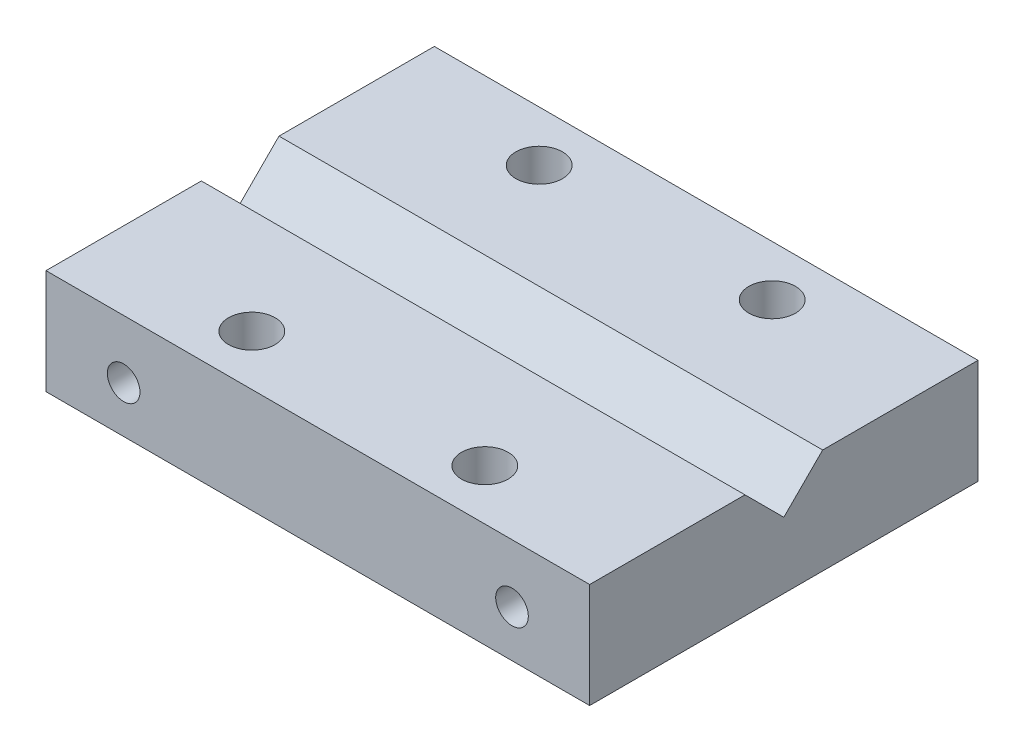
ISO-10303-21;
HEADER;
FILE_DESCRIPTION(('STEP AP214'),'2;1');
FILE_NAME('part.step','',(''),(''),'','','');
FILE_SCHEMA(('AUTOMOTIVE_DESIGN { 1 0 10303 214 1 1 1 1 }'));
ENDSEC;
DATA;
#1=APPLICATION_CONTEXT('core data for automotive mechanical design processes');
#2=APPLICATION_PROTOCOL_DEFINITION('international standard','automotive_design',2000,#1);
#3=PRODUCT_CONTEXT('',#1,'mechanical');
#4=PRODUCT('Part','Part','',(#3));
#5=PRODUCT_RELATED_PRODUCT_CATEGORY('part','',(#4));
#6=PRODUCT_DEFINITION_FORMATION('','',#4);
#7=PRODUCT_DEFINITION_CONTEXT('part definition',#1,'design');
#8=PRODUCT_DEFINITION('design','',#6,#7);
#9=PRODUCT_DEFINITION_SHAPE('','',#8);
#10=(LENGTH_UNIT() NAMED_UNIT(*) SI_UNIT(.MILLI.,.METRE.));
#11=(NAMED_UNIT(*) PLANE_ANGLE_UNIT() SI_UNIT($,.RADIAN.));
#12=(NAMED_UNIT(*) SI_UNIT($,.STERADIAN.) SOLID_ANGLE_UNIT());
#13=UNCERTAINTY_MEASURE_WITH_UNIT(LENGTH_MEASURE(1.E-05),#10,'distance_accuracy_value','');
#14=(GEOMETRIC_REPRESENTATION_CONTEXT(3) GLOBAL_UNCERTAINTY_ASSIGNED_CONTEXT((#13)) GLOBAL_UNIT_ASSIGNED_CONTEXT((#10,
#11,#12)) REPRESENTATION_CONTEXT('',''));
#15=CARTESIAN_POINT('',(0.,0.,0.));
#16=DIRECTION('',(0.,0.,1.));
#17=DIRECTION('',(1.,0.,0.));
#18=AXIS2_PLACEMENT_3D('',#15,#16,#17);
#19=CARTESIAN_POINT('',(0.,13.5,0.));
#20=DIRECTION('',(0.,1.,0.));
#21=DIRECTION('',(0.,0.,1.));
#22=AXIS2_PLACEMENT_3D('',#19,#20,#21);
#23=PLANE('',#22);
#24=CARTESIAN_POINT('',(17.7980364656382,13.5,15.5406732117812));
#25=DIRECTION('',(0.,1.,0.));
#26=DIRECTION('',(0.,0.,1.));
#27=AXIS2_PLACEMENT_3D('',#24,#25,#26);
#28=CIRCLE('',#27,3.);
#29=CARTESIAN_POINT('',(17.7980364656382,13.5,18.5406732117812));
#30=VERTEX_POINT('',#29);
#31=EDGE_CURVE('E199',#30,#30,#28,.F.);
#32=ORIENTED_EDGE('',*,*,#31,.T.);
#33=EDGE_LOOP('',(#32));
#34=FACE_BOUND('',#33,.T.);
#35=CARTESIAN_POINT('',(-12.2019635343618,13.5,15.5406732117812));
#36=DIRECTION('',(0.,1.,0.));
#37=DIRECTION('',(0.,0.,1.));
#38=AXIS2_PLACEMENT_3D('',#35,#36,#37);
#39=CIRCLE('',#38,3.);
#40=CARTESIAN_POINT('',(-12.2019635343618,13.5,18.5406732117812));
#41=VERTEX_POINT('',#40);
#42=EDGE_CURVE('E190',#41,#41,#39,.F.);
#43=ORIENTED_EDGE('',*,*,#42,.T.);
#44=EDGE_LOOP('',(#43));
#45=FACE_BOUND('',#44,.T.);
#46=DIRECTION('',(1.,0.,0.));
#47=VECTOR('',#46,1.);
#48=CARTESIAN_POINT('',(0.,13.5,2.04067321178118));
#49=LINE('',#48,#47);
#50=CARTESIAN_POINT('',(-32.2019635343618,13.5,2.04067321178118));
#51=VERTEX_POINT('',#50);
#52=CARTESIAN_POINT('',(37.7980364656382,13.5,2.04067321178118));
#53=VERTEX_POINT('',#52);
#54=EDGE_CURVE('E11',#51,#53,#49,.T.);
#55=ORIENTED_EDGE('',*,*,#54,.F.);
#56=DIRECTION('',(0.,0.,1.));
#57=VECTOR('',#56,1.);
#58=CARTESIAN_POINT('',(-32.2019635343618,13.5,-27.9593267882188));
#59=LINE('',#58,#57);
#60=CARTESIAN_POINT('',(-32.2019635343618,13.5,22.0406732117812));
#61=VERTEX_POINT('',#60);
#62=EDGE_CURVE('E100',#51,#61,#59,.T.);
#63=ORIENTED_EDGE('',*,*,#62,.T.);
#64=DIRECTION('',(1.,0.,0.));
#65=VECTOR('',#64,1.);
#66=CARTESIAN_POINT('',(-32.2019635343618,13.5,22.0406732117812));
#67=LINE('',#66,#65);
#68=CARTESIAN_POINT('',(37.7980364656382,13.5,22.0406732117812));
#69=VERTEX_POINT('',#68);
#70=EDGE_CURVE('E216',#61,#69,#67,.T.);
#71=ORIENTED_EDGE('',*,*,#70,.T.);
#72=DIRECTION('',(0.,0.,-1.));
#73=VECTOR('',#72,1.);
#74=CARTESIAN_POINT('',(37.7980364656382,13.5,-27.9593267882188));
#75=LINE('',#74,#73);
#76=EDGE_CURVE('E219',#69,#53,#75,.T.);
#77=ORIENTED_EDGE('',*,*,#76,.T.);
#78=EDGE_LOOP('',(#55,#63,#71,#77));
#79=FACE_BOUND('',#78,.T.);
#80=ADVANCED_FACE('F47',(#34,#45,#79),#23,.T.);
#81=CARTESIAN_POINT('',(-32.2019635343618,13.5,-27.9593267882188));
#82=DIRECTION('',(1.,0.,0.));
#83=DIRECTION('',(0.,0.,-1.));
#84=AXIS2_PLACEMENT_3D('',#81,#82,#83);
#85=PLANE('',#84);
#86=ORIENTED_EDGE('',*,*,#62,.F.);
#87=DIRECTION('',(0.,0.70710678118655,0.707106781186545));
#88=VECTOR('',#87,1.);
#89=CARTESIAN_POINT('',(-32.2019635343618,8.5,-2.95932678821879));
#90=LINE('',#89,#88);
#91=CARTESIAN_POINT('',(-32.2019635343618,8.5,-2.95932678821879));
#92=VERTEX_POINT('',#91);
#93=EDGE_CURVE('E202',#92,#51,#90,.T.);
#94=ORIENTED_EDGE('',*,*,#93,.F.);
#95=DIRECTION('',(0.,-0.707106781186544,0.707106781186551));
#96=VECTOR('',#95,1.);
#97=CARTESIAN_POINT('',(-32.2019635343618,8.5,-2.95932678821879));
#98=LINE('',#97,#96);
#99=CARTESIAN_POINT('',(-32.2019635343618,13.5,-7.95932678821884));
#100=VERTEX_POINT('',#99);
#101=EDGE_CURVE('E204',#100,#92,#98,.T.);
#102=ORIENTED_EDGE('',*,*,#101,.F.);
#103=CARTESIAN_POINT('',(-32.2019635343618,13.5,-27.9593267882188));
#104=VERTEX_POINT('',#103);
#105=EDGE_CURVE('E214',#104,#100,#59,.T.);
#106=ORIENTED_EDGE('',*,*,#105,.F.);
#107=DIRECTION('',(0.,-1.,0.));
#108=VECTOR('',#107,1.);
#109=CARTESIAN_POINT('',(-32.2019635343618,13.5,-27.9593267882188));
#110=LINE('',#109,#108);
#111=CARTESIAN_POINT('',(-32.2019635343618,0.,-27.9593267882188));
#112=VERTEX_POINT('',#111);
#113=EDGE_CURVE('E223',#104,#112,#110,.T.);
#114=ORIENTED_EDGE('',*,*,#113,.T.);
#115=DIRECTION('',(0.,0.,1.));
#116=VECTOR('',#115,1.);
#117=CARTESIAN_POINT('',(-32.2019635343618,0.,-27.9593267882188));
#118=LINE('',#117,#116);
#119=CARTESIAN_POINT('',(-32.2019635343618,0.,22.0406732117812));
#120=VERTEX_POINT('',#119);
#121=EDGE_CURVE('E213',#112,#120,#118,.T.);
#122=ORIENTED_EDGE('',*,*,#121,.T.);
#123=DIRECTION('',(0.,-1.,0.));
#124=VECTOR('',#123,1.);
#125=CARTESIAN_POINT('',(-32.2019635343618,13.5,22.0406732117812));
#126=LINE('',#125,#124);
#127=EDGE_CURVE('E237',#61,#120,#126,.T.);
#128=ORIENTED_EDGE('',*,*,#127,.F.);
#129=EDGE_LOOP('',(#86,#94,#102,#106,#114,#122,#128));
#130=FACE_BOUND('',#129,.T.);
#131=ADVANCED_FACE('F49',(#130),#85,.F.);
#132=CARTESIAN_POINT('',(-32.2019635343618,13.5,22.0406732117812));
#133=DIRECTION('',(0.,0.,-1.));
#134=DIRECTION('',(-1.,0.,0.));
#135=AXIS2_PLACEMENT_3D('',#132,#133,#134);
#136=PLANE('',#135);
#137=CARTESIAN_POINT('',(-22.2019635343618,6.,22.0406732117812));
#138=DIRECTION('',(0.,0.,1.));
#139=DIRECTION('',(1.,0.,0.));
#140=AXIS2_PLACEMENT_3D('',#137,#138,#139);
#141=CIRCLE('',#140,2.09999999999999);
#142=CARTESIAN_POINT('',(-20.1019635343619,6.,22.0406732117812));
#143=VERTEX_POINT('',#142);
#144=EDGE_CURVE('E144',#143,#143,#141,.T.);
#145=ORIENTED_EDGE('',*,*,#144,.F.);
#146=EDGE_LOOP('',(#145));
#147=FACE_BOUND('',#146,.T.);
#148=CARTESIAN_POINT('',(27.7980364656382,6.,22.0406732117812));
#149=DIRECTION('',(0.,0.,1.));
#150=DIRECTION('',(1.,0.,0.));
#151=AXIS2_PLACEMENT_3D('',#148,#149,#150);
#152=CIRCLE('',#151,2.09999999999999);
#153=CARTESIAN_POINT('',(29.8980364656381,6.,22.0406732117812));
#154=VERTEX_POINT('',#153);
#155=EDGE_CURVE('E143',#154,#154,#152,.T.);
#156=ORIENTED_EDGE('',*,*,#155,.F.);
#157=EDGE_LOOP('',(#156));
#158=FACE_BOUND('',#157,.T.);
#159=DIRECTION('',(1.,0.,0.));
#160=VECTOR('',#159,1.);
#161=CARTESIAN_POINT('',(-32.2019635343618,0.,22.0406732117812));
#162=LINE('',#161,#160);
#163=CARTESIAN_POINT('',(37.7980364656382,0.,22.0406732117812));
#164=VERTEX_POINT('',#163);
#165=EDGE_CURVE('E226',#120,#164,#162,.T.);
#166=ORIENTED_EDGE('',*,*,#165,.T.);
#167=DIRECTION('',(0.,-1.,0.));
#168=VECTOR('',#167,1.);
#169=CARTESIAN_POINT('',(37.7980364656382,13.5,22.0406732117812));
#170=LINE('',#169,#168);
#171=EDGE_CURVE('E234',#69,#164,#170,.T.);
#172=ORIENTED_EDGE('',*,*,#171,.F.);
#173=ORIENTED_EDGE('',*,*,#70,.F.);
#174=ORIENTED_EDGE('',*,*,#127,.T.);
#175=EDGE_LOOP('',(#166,#172,#173,#174));
#176=FACE_BOUND('',#175,.T.);
#177=ADVANCED_FACE('F270',(#147,#158,#176),#136,.F.);
#178=CARTESIAN_POINT('',(37.7980364656382,13.5,-27.9593267882188));
#179=DIRECTION('',(-1.,0.,0.));
#180=DIRECTION('',(0.,0.,1.));
#181=AXIS2_PLACEMENT_3D('',#178,#179,#180);
#182=PLANE('',#181);
#183=DIRECTION('',(0.,-0.707106781186544,0.707106781186551));
#184=VECTOR('',#183,1.);
#185=CARTESIAN_POINT('',(37.7980364656382,23.5,-17.9593267882189));
#186=LINE('',#185,#184);
#187=CARTESIAN_POINT('',(37.7980364656382,13.5,-7.95932678821884));
#188=VERTEX_POINT('',#187);
#189=CARTESIAN_POINT('',(37.7980364656382,8.5,-2.95932678821879));
#190=VERTEX_POINT('',#189);
#191=EDGE_CURVE('E62',#188,#190,#186,.T.);
#192=ORIENTED_EDGE('',*,*,#191,.T.);
#193=DIRECTION('',(0.,0.70710678118655,0.707106781186545));
#194=VECTOR('',#193,1.);
#195=CARTESIAN_POINT('',(37.7980364656382,-1.49999999999998,-12.9593267882187));
#196=LINE('',#195,#194);
#197=EDGE_CURVE('E210',#190,#53,#196,.T.);
#198=ORIENTED_EDGE('',*,*,#197,.T.);
#199=ORIENTED_EDGE('',*,*,#76,.F.);
#200=ORIENTED_EDGE('',*,*,#171,.T.);
#201=DIRECTION('',(0.,0.,-1.));
#202=VECTOR('',#201,1.);
#203=CARTESIAN_POINT('',(37.7980364656382,0.,-27.9593267882188));
#204=LINE('',#203,#202);
#205=CARTESIAN_POINT('',(37.7980364656382,0.,-27.9593267882188));
#206=VERTEX_POINT('',#205);
#207=EDGE_CURVE('E228',#164,#206,#204,.T.);
#208=ORIENTED_EDGE('',*,*,#207,.T.);
#209=DIRECTION('',(0.,-1.,0.));
#210=VECTOR('',#209,1.);
#211=CARTESIAN_POINT('',(37.7980364656382,13.5,-27.9593267882188));
#212=LINE('',#211,#210);
#213=CARTESIAN_POINT('',(37.7980364656382,13.5,-27.9593267882188));
#214=VERTEX_POINT('',#213);
#215=EDGE_CURVE('E232',#214,#206,#212,.T.);
#216=ORIENTED_EDGE('',*,*,#215,.F.);
#217=EDGE_CURVE('E218',#188,#214,#75,.T.);
#218=ORIENTED_EDGE('',*,*,#217,.F.);
#219=EDGE_LOOP('',(#192,#198,#199,#200,#208,#216,#218));
#220=FACE_BOUND('',#219,.T.);
#221=ADVANCED_FACE('F260',(#220),#182,.F.);
#222=CARTESIAN_POINT('',(-32.2019635343618,13.5,-27.9593267882188));
#223=DIRECTION('',(0.,0.,1.));
#224=DIRECTION('',(1.,0.,0.));
#225=AXIS2_PLACEMENT_3D('',#222,#223,#224);
#226=PLANE('',#225);
#227=CARTESIAN_POINT('',(27.7980364656382,6.,-27.9593267882188));
#228=DIRECTION('',(0.,0.,-1.));
#229=DIRECTION('',(-1.,0.,0.));
#230=AXIS2_PLACEMENT_3D('',#227,#228,#229);
#231=CIRCLE('',#230,2.1);
#232=CARTESIAN_POINT('',(25.6980364656382,6.,-27.9593267882188));
#233=VERTEX_POINT('',#232);
#234=EDGE_CURVE('E154',#233,#233,#231,.T.);
#235=ORIENTED_EDGE('',*,*,#234,.F.);
#236=EDGE_LOOP('',(#235));
#237=FACE_BOUND('',#236,.T.);
#238=CARTESIAN_POINT('',(-22.2019635343618,6.,-27.9593267882188));
#239=DIRECTION('',(0.,0.,-1.));
#240=DIRECTION('',(-1.,0.,0.));
#241=AXIS2_PLACEMENT_3D('',#238,#239,#240);
#242=CIRCLE('',#241,2.1);
#243=CARTESIAN_POINT('',(-24.3019635343618,6.,-27.9593267882188));
#244=VERTEX_POINT('',#243);
#245=EDGE_CURVE('E160',#244,#244,#242,.T.);
#246=ORIENTED_EDGE('',*,*,#245,.F.);
#247=EDGE_LOOP('',(#246));
#248=FACE_BOUND('',#247,.T.);
#249=DIRECTION('',(-1.,0.,0.));
#250=VECTOR('',#249,1.);
#251=CARTESIAN_POINT('',(-32.2019635343618,0.,-27.9593267882188));
#252=LINE('',#251,#250);
#253=EDGE_CURVE('E92',#206,#112,#252,.T.);
#254=ORIENTED_EDGE('',*,*,#253,.T.);
#255=ORIENTED_EDGE('',*,*,#113,.F.);
#256=DIRECTION('',(-1.,0.,0.));
#257=VECTOR('',#256,1.);
#258=CARTESIAN_POINT('',(-32.2019635343618,13.5,-27.9593267882188));
#259=LINE('',#258,#257);
#260=EDGE_CURVE('E71',#214,#104,#259,.T.);
#261=ORIENTED_EDGE('',*,*,#260,.F.);
#262=ORIENTED_EDGE('',*,*,#215,.T.);
#263=EDGE_LOOP('',(#254,#255,#261,#262));
#264=FACE_BOUND('',#263,.T.);
#265=ADVANCED_FACE('F248',(#237,#248,#264),#226,.F.);
#266=CARTESIAN_POINT('',(-12.2019635343618,13.5,-21.4593267882188));
#267=DIRECTION('',(0.,1.,0.));
#268=DIRECTION('',(0.,0.,1.));
#269=AXIS2_PLACEMENT_3D('',#266,#267,#268);
#270=CIRCLE('',#269,3.);
#271=CARTESIAN_POINT('',(-12.2019635343618,13.5,-18.4593267882188));
#272=VERTEX_POINT('',#271);
#273=EDGE_CURVE('E196',#272,#272,#270,.F.);
#274=ORIENTED_EDGE('',*,*,#273,.T.);
#275=EDGE_LOOP('',(#274));
#276=FACE_BOUND('',#275,.T.);
#277=CARTESIAN_POINT('',(17.7980364656382,13.5,-21.4593267882188));
#278=DIRECTION('',(0.,1.,0.));
#279=DIRECTION('',(0.,0.,1.));
#280=AXIS2_PLACEMENT_3D('',#277,#278,#279);
#281=CIRCLE('',#280,3.);
#282=CARTESIAN_POINT('',(17.7980364656382,13.5,-18.4593267882188));
#283=VERTEX_POINT('',#282);
#284=EDGE_CURVE('E193',#283,#283,#281,.F.);
#285=ORIENTED_EDGE('',*,*,#284,.T.);
#286=EDGE_LOOP('',(#285));
#287=FACE_BOUND('',#286,.T.);
#288=DIRECTION('',(-1.,0.,0.));
#289=VECTOR('',#288,1.);
#290=CARTESIAN_POINT('',(0.,13.5,-7.95932678821884));
#291=LINE('',#290,#289);
#292=EDGE_CURVE('E55',#188,#100,#291,.T.);
#293=ORIENTED_EDGE('',*,*,#292,.F.);
#294=ORIENTED_EDGE('',*,*,#217,.T.);
#295=ORIENTED_EDGE('',*,*,#260,.T.);
#296=ORIENTED_EDGE('',*,*,#105,.T.);
#297=EDGE_LOOP('',(#293,#294,#295,#296));
#298=FACE_BOUND('',#297,.T.);
#299=ADVANCED_FACE('F245',(#276,#287,#298),#23,.T.);
#300=CARTESIAN_POINT('',(0.,0.,0.));
#301=DIRECTION('',(0.,1.,0.));
#302=DIRECTION('',(0.,0.,1.));
#303=AXIS2_PLACEMENT_3D('',#300,#301,#302);
#304=PLANE('',#303);
#305=CARTESIAN_POINT('',(2.79803646563816,0.,15.5406732117812));
#306=DIRECTION('',(0.,-1.,0.));
#307=DIRECTION('',(0.,0.,-1.));
#308=AXIS2_PLACEMENT_3D('',#305,#306,#307);
#309=CIRCLE('',#308,1.65);
#310=CARTESIAN_POINT('',(2.79803646563816,0.,13.8906732117812));
#311=VERTEX_POINT('',#310);
#312=EDGE_CURVE('E166',#311,#311,#309,.T.);
#313=ORIENTED_EDGE('',*,*,#312,.F.);
#314=EDGE_LOOP('',(#313));
#315=FACE_BOUND('',#314,.T.);
#316=CARTESIAN_POINT('',(2.79803646563816,0.,-21.4593267882188));
#317=DIRECTION('',(0.,-1.,0.));
#318=DIRECTION('',(0.,0.,-1.));
#319=AXIS2_PLACEMENT_3D('',#316,#317,#318);
#320=CIRCLE('',#319,1.65);
#321=CARTESIAN_POINT('',(2.79803646563816,0.,-23.1093267882188));
#322=VERTEX_POINT('',#321);
#323=EDGE_CURVE('E172',#322,#322,#320,.T.);
#324=ORIENTED_EDGE('',*,*,#323,.F.);
#325=EDGE_LOOP('',(#324));
#326=FACE_BOUND('',#325,.T.);
#327=CARTESIAN_POINT('',(17.7980364656382,0.,15.5406732117812));
#328=DIRECTION('',(0.,1.,0.));
#329=DIRECTION('',(0.,0.,1.));
#330=AXIS2_PLACEMENT_3D('',#327,#328,#329);
#331=CIRCLE('',#330,3.);
#332=CARTESIAN_POINT('',(17.7980364656382,0.,18.5406732117812));
#333=VERTEX_POINT('',#332);
#334=EDGE_CURVE('E182',#333,#333,#331,.T.);
#335=ORIENTED_EDGE('',*,*,#334,.T.);
#336=EDGE_LOOP('',(#335));
#337=FACE_BOUND('',#336,.T.);
#338=CARTESIAN_POINT('',(-12.2019635343618,0.,-21.4593267882188));
#339=DIRECTION('',(0.,1.,0.));
#340=DIRECTION('',(0.,0.,1.));
#341=AXIS2_PLACEMENT_3D('',#338,#339,#340);
#342=CIRCLE('',#341,3.);
#343=CARTESIAN_POINT('',(-12.2019635343618,0.,-18.4593267882188));
#344=VERTEX_POINT('',#343);
#345=EDGE_CURVE('E181',#344,#344,#342,.T.);
#346=ORIENTED_EDGE('',*,*,#345,.T.);
#347=EDGE_LOOP('',(#346));
#348=FACE_BOUND('',#347,.T.);
#349=CARTESIAN_POINT('',(17.7980364656382,0.,-21.4593267882188));
#350=DIRECTION('',(0.,1.,0.));
#351=DIRECTION('',(0.,0.,1.));
#352=AXIS2_PLACEMENT_3D('',#349,#350,#351);
#353=CIRCLE('',#352,3.);
#354=CARTESIAN_POINT('',(17.7980364656382,0.,-18.4593267882188));
#355=VERTEX_POINT('',#354);
#356=EDGE_CURVE('E178',#355,#355,#353,.T.);
#357=ORIENTED_EDGE('',*,*,#356,.T.);
#358=EDGE_LOOP('',(#357));
#359=FACE_BOUND('',#358,.T.);
#360=CARTESIAN_POINT('',(-12.2019635343618,0.,15.5406732117812));
#361=DIRECTION('',(0.,1.,0.));
#362=DIRECTION('',(0.,0.,1.));
#363=AXIS2_PLACEMENT_3D('',#360,#361,#362);
#364=CIRCLE('',#363,3.);
#365=CARTESIAN_POINT('',(-12.2019635343618,0.,18.5406732117812));
#366=VERTEX_POINT('',#365);
#367=EDGE_CURVE('E185',#366,#366,#364,.T.);
#368=ORIENTED_EDGE('',*,*,#367,.T.);
#369=EDGE_LOOP('',(#368));
#370=FACE_BOUND('',#369,.T.);
#371=ORIENTED_EDGE('',*,*,#121,.F.);
#372=ORIENTED_EDGE('',*,*,#253,.F.);
#373=ORIENTED_EDGE('',*,*,#207,.F.);
#374=ORIENTED_EDGE('',*,*,#165,.F.);
#375=EDGE_LOOP('',(#371,#372,#373,#374));
#376=FACE_BOUND('',#375,.T.);
#377=ADVANCED_FACE('F247',(#315,#326,#337,#348,#359,#370,#376),#304,.F.);
#378=CARTESIAN_POINT('',(46.2980364656382,8.5,-2.95932678821879));
#379=DIRECTION('',(0.,-0.707106781186545,0.70710678118655));
#380=DIRECTION('',(0.,-0.70710678118655,-0.707106781186545));
#381=AXIS2_PLACEMENT_3D('',#378,#379,#380);
#382=PLANE('',#381);
#383=DIRECTION('',(-1.,0.,0.));
#384=VECTOR('',#383,1.);
#385=CARTESIAN_POINT('',(46.2980364656382,8.5,-2.95932678821879));
#386=LINE('',#385,#384);
#387=EDGE_CURVE('E207',#190,#92,#386,.T.);
#388=ORIENTED_EDGE('',*,*,#387,.T.);
#389=ORIENTED_EDGE('',*,*,#93,.T.);
#390=ORIENTED_EDGE('',*,*,#54,.T.);
#391=ORIENTED_EDGE('',*,*,#197,.F.);
#392=EDGE_LOOP('',(#388,#389,#390,#391));
#393=FACE_BOUND('',#392,.T.);
#394=ADVANCED_FACE('F256',(#393),#382,.F.);
#395=CARTESIAN_POINT('',(46.2980364656382,8.5,-2.95932678821879));
#396=DIRECTION('',(0.,-0.707106781186551,-0.707106781186544));
#397=DIRECTION('',(0.,0.707106781186544,-0.707106781186551));
#398=AXIS2_PLACEMENT_3D('',#395,#396,#397);
#399=PLANE('',#398);
#400=ORIENTED_EDGE('',*,*,#292,.T.);
#401=ORIENTED_EDGE('',*,*,#101,.T.);
#402=ORIENTED_EDGE('',*,*,#387,.F.);
#403=ORIENTED_EDGE('',*,*,#191,.F.);
#404=EDGE_LOOP('',(#400,#401,#402,#403));
#405=FACE_BOUND('',#404,.T.);
#406=ADVANCED_FACE('F240',(#405),#399,.F.);
#407=CARTESIAN_POINT('',(-12.2019635343618,200.,15.5406732117812));
#408=DIRECTION('',(0.,-1.,0.));
#409=DIRECTION('',(0.,0.,-1.));
#410=AXIS2_PLACEMENT_3D('',#407,#408,#409);
#411=CYLINDRICAL_SURFACE('',#410,3.);
#412=ORIENTED_EDGE('',*,*,#42,.F.);
#413=EDGE_LOOP('',(#412));
#414=FACE_BOUND('',#413,.T.);
#415=ORIENTED_EDGE('',*,*,#367,.F.);
#416=EDGE_LOOP('',(#415));
#417=FACE_BOUND('',#416,.T.);
#418=ADVANCED_FACE('F286',(#414,#417),#411,.F.);
#419=CARTESIAN_POINT('',(17.7980364656382,200.,-21.4593267882188));
#420=DIRECTION('',(0.,-1.,0.));
#421=DIRECTION('',(0.,0.,-1.));
#422=AXIS2_PLACEMENT_3D('',#419,#420,#421);
#423=CYLINDRICAL_SURFACE('',#422,3.);
#424=ORIENTED_EDGE('',*,*,#284,.F.);
#425=EDGE_LOOP('',(#424));
#426=FACE_BOUND('',#425,.T.);
#427=ORIENTED_EDGE('',*,*,#356,.F.);
#428=EDGE_LOOP('',(#427));
#429=FACE_BOUND('',#428,.T.);
#430=ADVANCED_FACE('F290',(#426,#429),#423,.F.);
#431=CARTESIAN_POINT('',(-12.2019635343618,200.,-21.4593267882188));
#432=DIRECTION('',(0.,-1.,0.));
#433=DIRECTION('',(0.,0.,-1.));
#434=AXIS2_PLACEMENT_3D('',#431,#432,#433);
#435=CYLINDRICAL_SURFACE('',#434,3.);
#436=ORIENTED_EDGE('',*,*,#273,.F.);
#437=EDGE_LOOP('',(#436));
#438=FACE_BOUND('',#437,.T.);
#439=ORIENTED_EDGE('',*,*,#345,.F.);
#440=EDGE_LOOP('',(#439));
#441=FACE_BOUND('',#440,.T.);
#442=ADVANCED_FACE('F292',(#438,#441),#435,.F.);
#443=CARTESIAN_POINT('',(17.7980364656382,200.,15.5406732117812));
#444=DIRECTION('',(0.,-1.,0.));
#445=DIRECTION('',(0.,0.,-1.));
#446=AXIS2_PLACEMENT_3D('',#443,#444,#445);
#447=CYLINDRICAL_SURFACE('',#446,3.);
#448=ORIENTED_EDGE('',*,*,#31,.F.);
#449=EDGE_LOOP('',(#448));
#450=FACE_BOUND('',#449,.T.);
#451=ORIENTED_EDGE('',*,*,#334,.F.);
#452=EDGE_LOOP('',(#451));
#453=FACE_BOUND('',#452,.T.);
#454=ADVANCED_FACE('F295',(#450,#453),#447,.F.);
#455=CARTESIAN_POINT('',(2.79803646563816,8.,-21.4593267882188));
#456=DIRECTION('',(0.,-1.,0.));
#457=DIRECTION('',(0.,0.,-1.));
#458=AXIS2_PLACEMENT_3D('',#455,#456,#457);
#459=CONICAL_SURFACE('',#458,1.65,1.02974425867665);
#460=CARTESIAN_POINT('',(2.79803646563815,8.99142002139548,-21.4593267882188));
#461=VERTEX_POINT('',#460);
#462=VERTEX_LOOP('',#461);
#463=FACE_BOUND('',#462,.T.);
#464=CARTESIAN_POINT('',(2.79803646563816,8.,-21.4593267882188));
#465=DIRECTION('',(0.,-1.,0.));
#466=DIRECTION('',(0.,0.,-1.));
#467=AXIS2_PLACEMENT_3D('',#464,#465,#466);
#468=CIRCLE('',#467,1.65);
#469=CARTESIAN_POINT('',(2.79803646563816,8.,-23.1093267882188));
#470=VERTEX_POINT('',#469);
#471=EDGE_CURVE('E175',#470,#470,#468,.T.);
#472=ORIENTED_EDGE('',*,*,#471,.T.);
#473=EDGE_LOOP('',(#472));
#474=FACE_BOUND('',#473,.T.);
#475=ADVANCED_FACE('F299',(#463,#474),#459,.F.);
#476=CARTESIAN_POINT('',(2.79803646563816,0.,-21.4593267882188));
#477=DIRECTION('',(0.,-1.,0.));
#478=DIRECTION('',(0.,0.,-1.));
#479=AXIS2_PLACEMENT_3D('',#476,#477,#478);
#480=CYLINDRICAL_SURFACE('',#479,1.65);
#481=ORIENTED_EDGE('',*,*,#471,.F.);
#482=EDGE_LOOP('',(#481));
#483=FACE_BOUND('',#482,.T.);
#484=ORIENTED_EDGE('',*,*,#323,.T.);
#485=EDGE_LOOP('',(#484));
#486=FACE_BOUND('',#485,.T.);
#487=ADVANCED_FACE('F306',(#483,#486),#480,.F.);
#488=CARTESIAN_POINT('',(2.79803646563816,8.,15.5406732117812));
#489=DIRECTION('',(0.,-1.,0.));
#490=DIRECTION('',(0.,0.,-1.));
#491=AXIS2_PLACEMENT_3D('',#488,#489,#490);
#492=CONICAL_SURFACE('',#491,1.65,1.02974425867665);
#493=CARTESIAN_POINT('',(2.79803646563815,8.99142002139548,15.5406732117812));
#494=VERTEX_POINT('',#493);
#495=VERTEX_LOOP('',#494);
#496=FACE_BOUND('',#495,.T.);
#497=CARTESIAN_POINT('',(2.79803646563816,8.,15.5406732117812));
#498=DIRECTION('',(0.,-1.,0.));
#499=DIRECTION('',(0.,0.,-1.));
#500=AXIS2_PLACEMENT_3D('',#497,#498,#499);
#501=CIRCLE('',#500,1.65);
#502=CARTESIAN_POINT('',(2.79803646563816,8.,13.8906732117812));
#503=VERTEX_POINT('',#502);
#504=EDGE_CURVE('E169',#503,#503,#501,.T.);
#505=ORIENTED_EDGE('',*,*,#504,.T.);
#506=EDGE_LOOP('',(#505));
#507=FACE_BOUND('',#506,.T.);
#508=ADVANCED_FACE('F310',(#496,#507),#492,.F.);
#509=CARTESIAN_POINT('',(2.79803646563816,0.,15.5406732117812));
#510=DIRECTION('',(0.,-1.,0.));
#511=DIRECTION('',(0.,0.,-1.));
#512=AXIS2_PLACEMENT_3D('',#509,#510,#511);
#513=CYLINDRICAL_SURFACE('',#512,1.65);
#514=ORIENTED_EDGE('',*,*,#504,.F.);
#515=EDGE_LOOP('',(#514));
#516=FACE_BOUND('',#515,.T.);
#517=ORIENTED_EDGE('',*,*,#312,.T.);
#518=EDGE_LOOP('',(#517));
#519=FACE_BOUND('',#518,.T.);
#520=ADVANCED_FACE('F314',(#516,#519),#513,.F.);
#521=CARTESIAN_POINT('',(-22.2019635343618,6.,-12.9593267882188));
#522=DIRECTION('',(0.,0.,-1.));
#523=DIRECTION('',(-1.,0.,0.));
#524=AXIS2_PLACEMENT_3D('',#521,#522,#523);
#525=CONICAL_SURFACE('',#524,2.1,1.02974425867665);
#526=CARTESIAN_POINT('',(-22.2019635343618,6.,-11.6975194882609));
#527=VERTEX_POINT('',#526);
#528=VERTEX_LOOP('',#527);
#529=FACE_BOUND('',#528,.T.);
#530=CARTESIAN_POINT('',(-22.2019635343618,6.,-12.9593267882188));
#531=DIRECTION('',(0.,0.,-1.));
#532=DIRECTION('',(-1.,0.,0.));
#533=AXIS2_PLACEMENT_3D('',#530,#531,#532);
#534=CIRCLE('',#533,2.1);
#535=CARTESIAN_POINT('',(-24.3019635343618,6.,-12.9593267882188));
#536=VERTEX_POINT('',#535);
#537=EDGE_CURVE('E163',#536,#536,#534,.T.);
#538=ORIENTED_EDGE('',*,*,#537,.T.);
#539=EDGE_LOOP('',(#538));
#540=FACE_BOUND('',#539,.T.);
#541=ADVANCED_FACE('F318',(#529,#540),#525,.F.);
#542=CARTESIAN_POINT('',(-22.2019635343618,6.,-27.9593267882188));
#543=DIRECTION('',(0.,0.,-1.));
#544=DIRECTION('',(-1.,0.,0.));
#545=AXIS2_PLACEMENT_3D('',#542,#543,#544);
#546=CYLINDRICAL_SURFACE('',#545,2.1);
#547=ORIENTED_EDGE('',*,*,#537,.F.);
#548=EDGE_LOOP('',(#547));
#549=FACE_BOUND('',#548,.T.);
#550=ORIENTED_EDGE('',*,*,#245,.T.);
#551=EDGE_LOOP('',(#550));
#552=FACE_BOUND('',#551,.T.);
#553=ADVANCED_FACE('F322',(#549,#552),#546,.F.);
#554=CARTESIAN_POINT('',(27.7980364656382,6.,-12.9593267882188));
#555=DIRECTION('',(0.,0.,-1.));
#556=DIRECTION('',(-1.,0.,0.));
#557=AXIS2_PLACEMENT_3D('',#554,#555,#556);
#558=CONICAL_SURFACE('',#557,2.1,1.02974425867665);
#559=CARTESIAN_POINT('',(27.7980364656382,6.,-11.6975194882609));
#560=VERTEX_POINT('',#559);
#561=VERTEX_LOOP('',#560);
#562=FACE_BOUND('',#561,.T.);
#563=CARTESIAN_POINT('',(27.7980364656382,6.,-12.9593267882188));
#564=DIRECTION('',(0.,0.,-1.));
#565=DIRECTION('',(-1.,0.,0.));
#566=AXIS2_PLACEMENT_3D('',#563,#564,#565);
#567=CIRCLE('',#566,2.1);
#568=CARTESIAN_POINT('',(25.6980364656382,6.,-12.9593267882188));
#569=VERTEX_POINT('',#568);
#570=EDGE_CURVE('E157',#569,#569,#567,.T.);
#571=ORIENTED_EDGE('',*,*,#570,.T.);
#572=EDGE_LOOP('',(#571));
#573=FACE_BOUND('',#572,.T.);
#574=ADVANCED_FACE('F326',(#562,#573),#558,.F.);
#575=CARTESIAN_POINT('',(27.7980364656382,6.,-27.9593267882188));
#576=DIRECTION('',(0.,0.,-1.));
#577=DIRECTION('',(-1.,0.,0.));
#578=AXIS2_PLACEMENT_3D('',#575,#576,#577);
#579=CYLINDRICAL_SURFACE('',#578,2.1);
#580=ORIENTED_EDGE('',*,*,#570,.F.);
#581=EDGE_LOOP('',(#580));
#582=FACE_BOUND('',#581,.T.);
#583=ORIENTED_EDGE('',*,*,#234,.T.);
#584=EDGE_LOOP('',(#583));
#585=FACE_BOUND('',#584,.T.);
#586=ADVANCED_FACE('F330',(#582,#585),#579,.F.);
#587=CARTESIAN_POINT('',(27.7980364656382,6.,7.04067321178121));
#588=DIRECTION('',(0.,0.,1.));
#589=DIRECTION('',(1.,0.,0.));
#590=AXIS2_PLACEMENT_3D('',#587,#588,#589);
#591=CONICAL_SURFACE('',#590,2.1,1.02974425867665);
#592=CARTESIAN_POINT('',(27.7980364656382,6.,5.77886591182334));
#593=VERTEX_POINT('',#592);
#594=VERTEX_LOOP('',#593);
#595=FACE_BOUND('',#594,.T.);
#596=CARTESIAN_POINT('',(27.7980364656382,6.,7.04067321178121));
#597=DIRECTION('',(0.,0.,1.));
#598=DIRECTION('',(1.,0.,0.));
#599=AXIS2_PLACEMENT_3D('',#596,#597,#598);
#600=CIRCLE('',#599,2.1);
#601=CARTESIAN_POINT('',(29.8980364656382,6.,7.04067321178121));
#602=VERTEX_POINT('',#601);
#603=EDGE_CURVE('E147',#602,#602,#600,.T.);
#604=ORIENTED_EDGE('',*,*,#603,.T.);
#605=EDGE_LOOP('',(#604));
#606=FACE_BOUND('',#605,.T.);
#607=ADVANCED_FACE('F334',(#595,#606),#591,.F.);
#608=CARTESIAN_POINT('',(27.7980364656382,6.,22.0406732117812));
#609=DIRECTION('',(0.,0.,1.));
#610=DIRECTION('',(1.,0.,0.));
#611=AXIS2_PLACEMENT_3D('',#608,#609,#610);
#612=CYLINDRICAL_SURFACE('',#611,2.09999999999999);
#613=ORIENTED_EDGE('',*,*,#603,.F.);
#614=EDGE_LOOP('',(#613));
#615=FACE_BOUND('',#614,.T.);
#616=ORIENTED_EDGE('',*,*,#155,.T.);
#617=EDGE_LOOP('',(#616));
#618=FACE_BOUND('',#617,.T.);
#619=ADVANCED_FACE('F137',(#615,#618),#612,.F.);
#620=CARTESIAN_POINT('',(-22.2019635343618,6.,7.04067321178121));
#621=DIRECTION('',(0.,0.,1.));
#622=DIRECTION('',(1.,0.,0.));
#623=AXIS2_PLACEMENT_3D('',#620,#621,#622);
#624=CONICAL_SURFACE('',#623,2.1,1.02974425867665);
#625=CARTESIAN_POINT('',(-22.2019635343618,6.,5.77886591182334));
#626=VERTEX_POINT('',#625);
#627=VERTEX_LOOP('',#626);
#628=FACE_BOUND('',#627,.T.);
#629=CARTESIAN_POINT('',(-22.2019635343618,6.,7.04067321178121));
#630=DIRECTION('',(0.,0.,1.));
#631=DIRECTION('',(1.,0.,0.));
#632=AXIS2_PLACEMENT_3D('',#629,#630,#631);
#633=CIRCLE('',#632,2.1);
#634=CARTESIAN_POINT('',(-20.1019635343618,6.,7.04067321178121));
#635=VERTEX_POINT('',#634);
#636=EDGE_CURVE('E141',#635,#635,#633,.T.);
#637=ORIENTED_EDGE('',*,*,#636,.T.);
#638=EDGE_LOOP('',(#637));
#639=FACE_BOUND('',#638,.T.);
#640=ADVANCED_FACE('F133',(#628,#639),#624,.F.);
#641=CARTESIAN_POINT('',(-22.2019635343618,6.,22.0406732117812));
#642=DIRECTION('',(0.,0.,1.));
#643=DIRECTION('',(1.,0.,0.));
#644=AXIS2_PLACEMENT_3D('',#641,#642,#643);
#645=CYLINDRICAL_SURFACE('',#644,2.09999999999999);
#646=ORIENTED_EDGE('',*,*,#636,.F.);
#647=EDGE_LOOP('',(#646));
#648=FACE_BOUND('',#647,.T.);
#649=ORIENTED_EDGE('',*,*,#144,.T.);
#650=EDGE_LOOP('',(#649));
#651=FACE_BOUND('',#650,.T.);
#652=ADVANCED_FACE('F136',(#648,#651),#645,.F.);
#653=CLOSED_SHELL('',(#80,#131,#177,#221,#265,#299,#377,#394,#406,#418,#430,#442,#454,#475,#487,
#508,#520,#541,#553,#574,#586,#607,#619,#640,#652));
#654=MANIFOLD_SOLID_BREP('B2',#653);
#655=ADVANCED_BREP_SHAPE_REPRESENTATION('',(#18,#654),#14);
#656=SHAPE_DEFINITION_REPRESENTATION(#9,#655);
ENDSEC;
END-ISO-10303-21;
